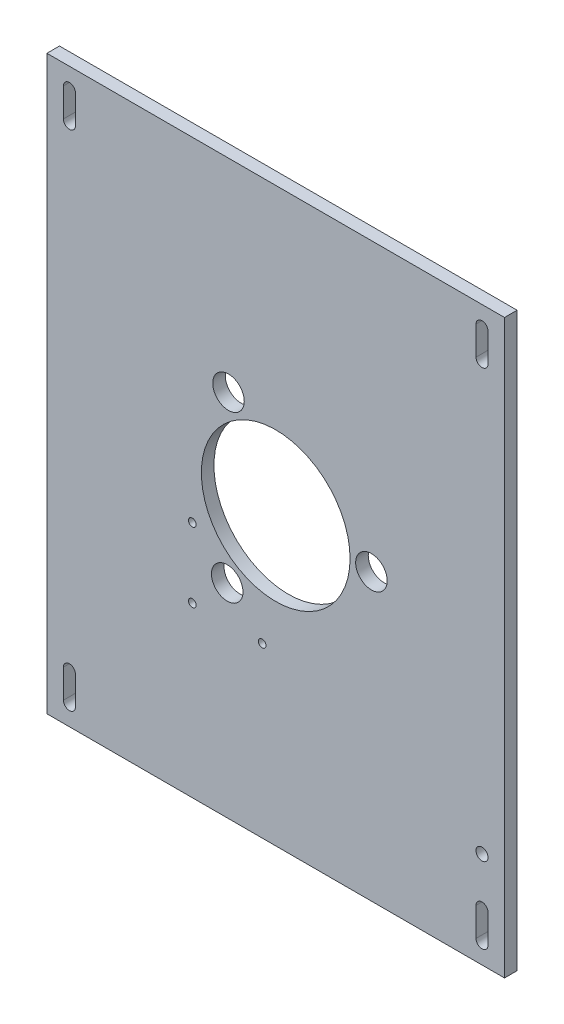
ISO-10303-21;
HEADER;
FILE_DESCRIPTION(('STEP AP214'),'2;1');
FILE_NAME('part.step','',(''),(''),'','','');
FILE_SCHEMA(('AUTOMOTIVE_DESIGN { 1 0 10303 214 1 1 1 1 }'));
ENDSEC;
DATA;
#1=APPLICATION_CONTEXT('core data for automotive mechanical design processes');
#2=APPLICATION_PROTOCOL_DEFINITION('international standard','automotive_design',2000,#1);
#3=PRODUCT_CONTEXT('',#1,'mechanical');
#4=PRODUCT('Part','Part','',(#3));
#5=PRODUCT_RELATED_PRODUCT_CATEGORY('part','',(#4));
#6=PRODUCT_DEFINITION_FORMATION('','',#4);
#7=PRODUCT_DEFINITION_CONTEXT('part definition',#1,'design');
#8=PRODUCT_DEFINITION('design','',#6,#7);
#9=PRODUCT_DEFINITION_SHAPE('','',#8);
#10=(LENGTH_UNIT() NAMED_UNIT(*) SI_UNIT(.MILLI.,.METRE.));
#11=(NAMED_UNIT(*) PLANE_ANGLE_UNIT() SI_UNIT($,.RADIAN.));
#12=(NAMED_UNIT(*) SI_UNIT($,.STERADIAN.) SOLID_ANGLE_UNIT());
#13=UNCERTAINTY_MEASURE_WITH_UNIT(LENGTH_MEASURE(1.E-05),#10,'distance_accuracy_value','');
#14=(GEOMETRIC_REPRESENTATION_CONTEXT(3) GLOBAL_UNCERTAINTY_ASSIGNED_CONTEXT((#13)) GLOBAL_UNIT_ASSIGNED_CONTEXT((#10,
#11,#12)) REPRESENTATION_CONTEXT('',''));
#15=CARTESIAN_POINT('',(0.,0.,0.));
#16=DIRECTION('',(0.,0.,1.));
#17=DIRECTION('',(1.,0.,0.));
#18=AXIS2_PLACEMENT_3D('',#15,#16,#17);
#19=CARTESIAN_POINT('',(0.,0.,5.588));
#20=DIRECTION('',(0.,0.,-1.));
#21=DIRECTION('',(-1.,0.,0.));
#22=AXIS2_PLACEMENT_3D('',#19,#20,#21);
#23=PLANE('',#22);
#24=DIRECTION('',(0.,1.,0.));
#25=VECTOR('',#24,1.);
#26=CARTESIAN_POINT('',(-94.265,118.11,5.58800000000004));
#27=LINE('',#26,#25);
#28=CARTESIAN_POINT('',(-94.265,105.41,5.58800000000004));
#29=VERTEX_POINT('',#28);
#30=CARTESIAN_POINT('',(-94.265,118.11,5.58800000000004));
#31=VERTEX_POINT('',#30);
#32=EDGE_CURVE('E184',#29,#31,#27,.T.);
#33=ORIENTED_EDGE('',*,*,#32,.T.);
#34=CARTESIAN_POINT('',(-91.6,118.11,5.58800000000004));
#35=DIRECTION('',(0.,0.,-1.));
#36=DIRECTION('',(1.,0.,0.));
#37=AXIS2_PLACEMENT_3D('',#34,#35,#36);
#38=CIRCLE('',#37,2.66500000000008);
#39=CARTESIAN_POINT('',(-88.9349999999999,118.11,5.58800000000004));
#40=VERTEX_POINT('',#39);
#41=EDGE_CURVE('E178',#31,#40,#38,.T.);
#42=ORIENTED_EDGE('',*,*,#41,.T.);
#43=DIRECTION('',(0.,-1.,0.));
#44=VECTOR('',#43,1.);
#45=CARTESIAN_POINT('',(-88.9349999999999,118.11,5.58800000000004));
#46=LINE('',#45,#44);
#47=CARTESIAN_POINT('',(-88.9349999999999,105.41,5.588));
#48=VERTEX_POINT('',#47);
#49=EDGE_CURVE('E187',#40,#48,#46,.T.);
#50=ORIENTED_EDGE('',*,*,#49,.T.);
#51=CARTESIAN_POINT('',(-91.6,105.41,5.58800000000004));
#52=DIRECTION('',(0.,0.,-1.));
#53=DIRECTION('',(1.,0.,0.));
#54=AXIS2_PLACEMENT_3D('',#51,#52,#53);
#55=CIRCLE('',#54,2.66500000000008);
#56=EDGE_CURVE('E54',#48,#29,#55,.T.);
#57=ORIENTED_EDGE('',*,*,#56,.T.);
#58=EDGE_LOOP('',(#33,#42,#50,#57));
#59=FACE_BOUND('',#58,.T.);
#60=CARTESIAN_POINT('',(91.6,118.11,5.58800000000004));
#61=DIRECTION('',(0.,0.,1.));
#62=DIRECTION('',(-1.,0.,0.));
#63=AXIS2_PLACEMENT_3D('',#60,#61,#62);
#64=CIRCLE('',#63,2.66500000000008);
#65=CARTESIAN_POINT('',(94.265,118.11,5.58800000000004));
#66=VERTEX_POINT('',#65);
#67=CARTESIAN_POINT('',(88.9349999999999,118.11,5.58800000000004));
#68=VERTEX_POINT('',#67);
#69=EDGE_CURVE('E243',#66,#68,#64,.T.);
#70=ORIENTED_EDGE('',*,*,#69,.F.);
#71=DIRECTION('',(0.,1.,0.));
#72=VECTOR('',#71,1.);
#73=CARTESIAN_POINT('',(94.265,118.11,5.58800000000004));
#74=LINE('',#73,#72);
#75=CARTESIAN_POINT('',(94.265,105.41,5.588));
#76=VERTEX_POINT('',#75);
#77=EDGE_CURVE('E245',#76,#66,#74,.T.);
#78=ORIENTED_EDGE('',*,*,#77,.F.);
#79=CARTESIAN_POINT('',(91.6,105.41,5.58800000000004));
#80=DIRECTION('',(0.,0.,1.));
#81=DIRECTION('',(-1.,0.,0.));
#82=AXIS2_PLACEMENT_3D('',#79,#80,#81);
#83=CIRCLE('',#82,2.66500000000008);
#84=CARTESIAN_POINT('',(88.9349999999999,105.41,5.58800000000004));
#85=VERTEX_POINT('',#84);
#86=EDGE_CURVE('E248',#85,#76,#83,.T.);
#87=ORIENTED_EDGE('',*,*,#86,.F.);
#88=DIRECTION('',(0.,-1.,0.));
#89=VECTOR('',#88,1.);
#90=CARTESIAN_POINT('',(88.9349999999999,118.11,5.58800000000004));
#91=LINE('',#90,#89);
#92=EDGE_CURVE('E251',#68,#85,#91,.T.);
#93=ORIENTED_EDGE('',*,*,#92,.F.);
#94=EDGE_LOOP('',(#70,#78,#87,#93));
#95=FACE_BOUND('',#94,.T.);
#96=DIRECTION('',(0.,-1.,0.));
#97=VECTOR('',#96,1.);
#98=CARTESIAN_POINT('',(94.265,-118.11,5.58800000000004));
#99=LINE('',#98,#97);
#100=CARTESIAN_POINT('',(94.265,-105.41,5.58800000000004));
#101=VERTEX_POINT('',#100);
#102=CARTESIAN_POINT('',(94.265,-118.11,5.58800000000004));
#103=VERTEX_POINT('',#102);
#104=EDGE_CURVE('E284',#101,#103,#99,.T.);
#105=ORIENTED_EDGE('',*,*,#104,.T.);
#106=CARTESIAN_POINT('',(91.6,-118.11,5.58800000000004));
#107=DIRECTION('',(0.,0.,-1.));
#108=DIRECTION('',(-1.,0.,0.));
#109=AXIS2_PLACEMENT_3D('',#106,#107,#108);
#110=CIRCLE('',#109,2.66500000000008);
#111=CARTESIAN_POINT('',(88.9349999999999,-118.11,5.58800000000004));
#112=VERTEX_POINT('',#111);
#113=EDGE_CURVE('E274',#103,#112,#110,.T.);
#114=ORIENTED_EDGE('',*,*,#113,.T.);
#115=DIRECTION('',(0.,1.,0.));
#116=VECTOR('',#115,1.);
#117=CARTESIAN_POINT('',(88.9349999999999,-118.11,5.58800000000004));
#118=LINE('',#117,#116);
#119=CARTESIAN_POINT('',(88.9349999999999,-105.41,5.588));
#120=VERTEX_POINT('',#119);
#121=EDGE_CURVE('E277',#112,#120,#118,.T.);
#122=ORIENTED_EDGE('',*,*,#121,.T.);
#123=CARTESIAN_POINT('',(91.6,-105.41,5.58800000000004));
#124=DIRECTION('',(0.,0.,-1.));
#125=DIRECTION('',(-1.,0.,0.));
#126=AXIS2_PLACEMENT_3D('',#123,#124,#125);
#127=CIRCLE('',#126,2.66500000000008);
#128=EDGE_CURVE('E281',#120,#101,#127,.T.);
#129=ORIENTED_EDGE('',*,*,#128,.T.);
#130=EDGE_LOOP('',(#105,#114,#122,#129));
#131=FACE_BOUND('',#130,.T.);
#132=CARTESIAN_POINT('',(91.6,-84.3249999936522,5.58800000000004));
#133=DIRECTION('',(0.,0.,1.));
#134=DIRECTION('',(1.,0.,0.));
#135=AXIS2_PLACEMENT_3D('',#132,#133,#134);
#136=CIRCLE('',#135,2.66500000000008);
#137=CARTESIAN_POINT('',(94.265,-84.3249999936522,5.58800000000004));
#138=VERTEX_POINT('',#137);
#139=EDGE_CURVE('E299',#138,#138,#136,.T.);
#140=ORIENTED_EDGE('',*,*,#139,.F.);
#141=EDGE_LOOP('',(#140));
#142=FACE_BOUND('',#141,.T.);
#143=CARTESIAN_POINT('',(-37.0355466155229,-21.139735697336,5.588));
#144=DIRECTION('',(0.,0.,-1.));
#145=DIRECTION('',(-1.,0.,0.));
#146=AXIS2_PLACEMENT_3D('',#143,#144,#145);
#147=CIRCLE('',#146,1.7);
#148=CARTESIAN_POINT('',(-38.7355466155229,-21.139735697336,5.588));
#149=VERTEX_POINT('',#148);
#150=EDGE_CURVE('E312',#149,#149,#147,.T.);
#151=ORIENTED_EDGE('',*,*,#150,.T.);
#152=EDGE_LOOP('',(#151));
#153=FACE_BOUND('',#152,.T.);
#154=CARTESIAN_POINT('',(-37.0355466155229,-52.139735697336,5.588));
#155=DIRECTION('',(0.,0.,-1.));
#156=DIRECTION('',(-1.,0.,0.));
#157=AXIS2_PLACEMENT_3D('',#154,#155,#156);
#158=CIRCLE('',#157,1.7);
#159=CARTESIAN_POINT('',(-38.7355466155229,-52.139735697336,5.588));
#160=VERTEX_POINT('',#159);
#161=EDGE_CURVE('E322',#160,#160,#158,.T.);
#162=ORIENTED_EDGE('',*,*,#161,.T.);
#163=EDGE_LOOP('',(#162));
#164=FACE_BOUND('',#163,.T.);
#165=CARTESIAN_POINT('',(-6.03554661552294,-52.139735697336,5.588));
#166=DIRECTION('',(0.,0.,-1.));
#167=DIRECTION('',(-1.,0.,0.));
#168=AXIS2_PLACEMENT_3D('',#165,#166,#167);
#169=CIRCLE('',#168,1.7);
#170=CARTESIAN_POINT('',(-7.73554661552294,-52.139735697336,5.588));
#171=VERTEX_POINT('',#170);
#172=EDGE_CURVE('E309',#171,#171,#169,.T.);
#173=ORIENTED_EDGE('',*,*,#172,.T.);
#174=EDGE_LOOP('',(#173));
#175=FACE_BOUND('',#174,.T.);
#176=CARTESIAN_POINT('',(-20.9631685940789,36.970198302095,5.58799999999998));
#177=DIRECTION('',(0.,0.,1.));
#178=DIRECTION('',(-0.500000000000004,0.866025403784436,0.));
#179=AXIS2_PLACEMENT_3D('',#176,#177,#178);
#180=CIRCLE('',#179,6.99999999999994);
#181=CARTESIAN_POINT('',(-24.4631685940789,43.032376128586,5.58799999999998));
#182=VERTEX_POINT('',#181);
#183=EDGE_CURVE('E330',#182,#182,#180,.T.);
#184=ORIENTED_EDGE('',*,*,#183,.F.);
#185=EDGE_LOOP('',(#184));
#186=FACE_BOUND('',#185,.T.);
#187=CARTESIAN_POINT('',(-21.5355466155229,-36.639735697336,5.58799999999998));
#188=DIRECTION('',(0.,0.,1.));
#189=DIRECTION('',(-0.499999999999992,-0.866025403784443,0.));
#190=AXIS2_PLACEMENT_3D('',#187,#188,#189);
#191=CIRCLE('',#190,6.99999999999994);
#192=CARTESIAN_POINT('',(-25.0355466155229,-42.7019135238271,5.58799999999998));
#193=VERTEX_POINT('',#192);
#194=EDGE_CURVE('E315',#193,#193,#191,.T.);
#195=ORIENTED_EDGE('',*,*,#194,.F.);
#196=EDGE_LOOP('',(#195));
#197=FACE_BOUND('',#196,.T.);
#198=CARTESIAN_POINT('',(42.498715209602,-0.330462604759246,5.58799999999998));
#199=DIRECTION('',(0.,0.,1.));
#200=DIRECTION('',(1.,0.,0.));
#201=AXIS2_PLACEMENT_3D('',#198,#199,#200);
#202=CIRCLE('',#201,6.99999999999994);
#203=CARTESIAN_POINT('',(49.4987152096019,-0.330462604759246,5.58799999999998));
#204=VERTEX_POINT('',#203);
#205=EDGE_CURVE('E336',#204,#204,#202,.T.);
#206=ORIENTED_EDGE('',*,*,#205,.F.);
#207=EDGE_LOOP('',(#206));
#208=FACE_BOUND('',#207,.T.);
#209=DIRECTION('',(0.,1.,0.));
#210=VECTOR('',#209,1.);
#211=CARTESIAN_POINT('',(101.6,-127.,5.588));
#212=LINE('',#211,#210);
#213=CARTESIAN_POINT('',(101.6,-127.,5.588));
#214=VERTEX_POINT('',#213);
#215=CARTESIAN_POINT('',(101.6,127.,5.588));
#216=VERTEX_POINT('',#215);
#217=EDGE_CURVE('E347',#214,#216,#212,.T.);
#218=ORIENTED_EDGE('',*,*,#217,.T.);
#219=DIRECTION('',(-1.,0.,0.));
#220=VECTOR('',#219,1.);
#221=CARTESIAN_POINT('',(-101.6,127.,5.588));
#222=LINE('',#221,#220);
#223=CARTESIAN_POINT('',(-101.6,127.,5.588));
#224=VERTEX_POINT('',#223);
#225=EDGE_CURVE('E350',#216,#224,#222,.T.);
#226=ORIENTED_EDGE('',*,*,#225,.T.);
#227=DIRECTION('',(0.,-1.,0.));
#228=VECTOR('',#227,1.);
#229=CARTESIAN_POINT('',(-101.6,-127.,5.588));
#230=LINE('',#229,#228);
#231=CARTESIAN_POINT('',(-101.6,-127.,5.588));
#232=VERTEX_POINT('',#231);
#233=EDGE_CURVE('E353',#224,#232,#230,.T.);
#234=ORIENTED_EDGE('',*,*,#233,.T.);
#235=DIRECTION('',(1.,0.,0.));
#236=VECTOR('',#235,1.);
#237=CARTESIAN_POINT('',(-101.6,-127.,5.588));
#238=LINE('',#237,#236);
#239=EDGE_CURVE('E355',#232,#214,#238,.T.);
#240=ORIENTED_EDGE('',*,*,#239,.T.);
#241=EDGE_LOOP('',(#218,#226,#234,#240));
#242=FACE_BOUND('',#241,.T.);
#243=CARTESIAN_POINT('',(0.,0.,5.588));
#244=DIRECTION('',(0.,0.,1.));
#245=DIRECTION('',(1.,0.,0.));
#246=AXIS2_PLACEMENT_3D('',#243,#244,#245);
#247=CIRCLE('',#246,33.02);
#248=CARTESIAN_POINT('',(33.02,0.,5.588));
#249=VERTEX_POINT('',#248);
#250=EDGE_CURVE('E340',#249,#249,#247,.T.);
#251=ORIENTED_EDGE('',*,*,#250,.F.);
#252=EDGE_LOOP('',(#251));
#253=FACE_BOUND('',#252,.T.);
#254=CARTESIAN_POINT('',(-91.6,-118.11,5.58800000000004));
#255=DIRECTION('',(0.,0.,1.));
#256=DIRECTION('',(1.,0.,0.));
#257=AXIS2_PLACEMENT_3D('',#254,#255,#256);
#258=CIRCLE('',#257,2.66500000000008);
#259=CARTESIAN_POINT('',(-94.265,-118.11,5.58800000000004));
#260=VERTEX_POINT('',#259);
#261=CARTESIAN_POINT('',(-88.9349999999999,-118.11,5.58800000000004));
#262=VERTEX_POINT('',#261);
#263=EDGE_CURVE('E212',#260,#262,#258,.T.);
#264=ORIENTED_EDGE('',*,*,#263,.F.);
#265=DIRECTION('',(0.,-1.,0.));
#266=VECTOR('',#265,1.);
#267=CARTESIAN_POINT('',(-94.265,-118.11,5.58800000000004));
#268=LINE('',#267,#266);
#269=CARTESIAN_POINT('',(-94.265,-105.41,5.588));
#270=VERTEX_POINT('',#269);
#271=EDGE_CURVE('E214',#270,#260,#268,.T.);
#272=ORIENTED_EDGE('',*,*,#271,.F.);
#273=CARTESIAN_POINT('',(-91.6,-105.41,5.58800000000004));
#274=DIRECTION('',(0.,0.,1.));
#275=DIRECTION('',(1.,0.,0.));
#276=AXIS2_PLACEMENT_3D('',#273,#274,#275);
#277=CIRCLE('',#276,2.66500000000008);
#278=CARTESIAN_POINT('',(-88.9349999999999,-105.41,5.58800000000004));
#279=VERTEX_POINT('',#278);
#280=EDGE_CURVE('E217',#279,#270,#277,.T.);
#281=ORIENTED_EDGE('',*,*,#280,.F.);
#282=DIRECTION('',(0.,1.,0.));
#283=VECTOR('',#282,1.);
#284=CARTESIAN_POINT('',(-88.9349999999999,-118.11,5.58800000000004));
#285=LINE('',#284,#283);
#286=EDGE_CURVE('E220',#262,#279,#285,.T.);
#287=ORIENTED_EDGE('',*,*,#286,.F.);
#288=EDGE_LOOP('',(#264,#272,#281,#287));
#289=FACE_BOUND('',#288,.T.);
#290=ADVANCED_FACE('F37',(#59,#95,#131,#142,#153,#164,#175,#186,#197,#208,#242,#253,#289),#23,.F.);
#291=CARTESIAN_POINT('',(0.,0.,0.));
#292=DIRECTION('',(0.,0.,-1.));
#293=DIRECTION('',(-1.,0.,0.));
#294=AXIS2_PLACEMENT_3D('',#291,#292,#293);
#295=PLANE('',#294);
#296=CARTESIAN_POINT('',(-91.6,118.11,0.));
#297=DIRECTION('',(0.,0.,-1.));
#298=DIRECTION('',(1.,0.,0.));
#299=AXIS2_PLACEMENT_3D('',#296,#297,#298);
#300=CIRCLE('',#299,2.66500000000008);
#301=CARTESIAN_POINT('',(-94.265,118.11,0.));
#302=VERTEX_POINT('',#301);
#303=CARTESIAN_POINT('',(-88.9349999999999,118.11,0.));
#304=VERTEX_POINT('',#303);
#305=EDGE_CURVE('E62',#302,#304,#300,.T.);
#306=ORIENTED_EDGE('',*,*,#305,.F.);
#307=DIRECTION('',(0.,1.,0.));
#308=VECTOR('',#307,1.);
#309=CARTESIAN_POINT('',(-94.265,118.11,0.));
#310=LINE('',#309,#308);
#311=CARTESIAN_POINT('',(-94.265,105.41,0.));
#312=VERTEX_POINT('',#311);
#313=EDGE_CURVE('E193',#312,#302,#310,.T.);
#314=ORIENTED_EDGE('',*,*,#313,.F.);
#315=CARTESIAN_POINT('',(-91.6,105.41,0.));
#316=DIRECTION('',(0.,0.,-1.));
#317=DIRECTION('',(1.,0.,0.));
#318=AXIS2_PLACEMENT_3D('',#315,#316,#317);
#319=CIRCLE('',#318,2.66500000000008);
#320=CARTESIAN_POINT('',(-88.9349999999999,105.41,0.));
#321=VERTEX_POINT('',#320);
#322=EDGE_CURVE('E196',#321,#312,#319,.T.);
#323=ORIENTED_EDGE('',*,*,#322,.F.);
#324=DIRECTION('',(0.,-1.,0.));
#325=VECTOR('',#324,1.);
#326=CARTESIAN_POINT('',(-88.9349999999999,118.11,0.));
#327=LINE('',#326,#325);
#328=EDGE_CURVE('E202',#304,#321,#327,.T.);
#329=ORIENTED_EDGE('',*,*,#328,.F.);
#330=EDGE_LOOP('',(#306,#314,#323,#329));
#331=FACE_BOUND('',#330,.T.);
#332=CARTESIAN_POINT('',(91.6,-118.11,0.));
#333=DIRECTION('',(0.,0.,-1.));
#334=DIRECTION('',(-1.,0.,0.));
#335=AXIS2_PLACEMENT_3D('',#332,#333,#334);
#336=CIRCLE('',#335,2.66500000000008);
#337=CARTESIAN_POINT('',(94.265,-118.11,0.));
#338=VERTEX_POINT('',#337);
#339=CARTESIAN_POINT('',(88.9349999999999,-118.11,0.));
#340=VERTEX_POINT('',#339);
#341=EDGE_CURVE('E267',#338,#340,#336,.T.);
#342=ORIENTED_EDGE('',*,*,#341,.F.);
#343=DIRECTION('',(0.,-1.,0.));
#344=VECTOR('',#343,1.);
#345=CARTESIAN_POINT('',(94.265,-118.11,0.));
#346=LINE('',#345,#344);
#347=CARTESIAN_POINT('',(94.265,-105.41,0.));
#348=VERTEX_POINT('',#347);
#349=EDGE_CURVE('E278',#348,#338,#346,.T.);
#350=ORIENTED_EDGE('',*,*,#349,.F.);
#351=CARTESIAN_POINT('',(91.6,-105.41,0.));
#352=DIRECTION('',(0.,0.,-1.));
#353=DIRECTION('',(-1.,0.,0.));
#354=AXIS2_PLACEMENT_3D('',#351,#352,#353);
#355=CIRCLE('',#354,2.66500000000008);
#356=CARTESIAN_POINT('',(88.9349999999999,-105.41,0.));
#357=VERTEX_POINT('',#356);
#358=EDGE_CURVE('E292',#357,#348,#355,.T.);
#359=ORIENTED_EDGE('',*,*,#358,.F.);
#360=DIRECTION('',(0.,1.,0.));
#361=VECTOR('',#360,1.);
#362=CARTESIAN_POINT('',(88.9349999999999,-118.11,0.));
#363=LINE('',#362,#361);
#364=EDGE_CURVE('E289',#340,#357,#363,.T.);
#365=ORIENTED_EDGE('',*,*,#364,.F.);
#366=EDGE_LOOP('',(#342,#350,#359,#365));
#367=FACE_BOUND('',#366,.T.);
#368=CARTESIAN_POINT('',(91.6,-84.3249999936522,0.));
#369=DIRECTION('',(0.,0.,1.));
#370=DIRECTION('',(1.,0.,0.));
#371=AXIS2_PLACEMENT_3D('',#368,#369,#370);
#372=CIRCLE('',#371,2.66500000000008);
#373=CARTESIAN_POINT('',(94.265,-84.3249999936522,0.));
#374=VERTEX_POINT('',#373);
#375=EDGE_CURVE('E306',#374,#374,#372,.T.);
#376=ORIENTED_EDGE('',*,*,#375,.T.);
#377=EDGE_LOOP('',(#376));
#378=FACE_BOUND('',#377,.T.);
#379=CARTESIAN_POINT('',(-37.0355466155229,-21.139735697336,0.));
#380=DIRECTION('',(0.,0.,-1.));
#381=DIRECTION('',(-1.,0.,0.));
#382=AXIS2_PLACEMENT_3D('',#379,#380,#381);
#383=CIRCLE('',#382,1.7);
#384=CARTESIAN_POINT('',(-38.7355466155229,-21.139735697336,0.));
#385=VERTEX_POINT('',#384);
#386=EDGE_CURVE('E316',#385,#385,#383,.T.);
#387=ORIENTED_EDGE('',*,*,#386,.F.);
#388=EDGE_LOOP('',(#387));
#389=FACE_BOUND('',#388,.T.);
#390=CARTESIAN_POINT('',(-37.0355466155229,-52.139735697336,0.));
#391=DIRECTION('',(0.,0.,-1.));
#392=DIRECTION('',(-1.,0.,0.));
#393=AXIS2_PLACEMENT_3D('',#390,#391,#392);
#394=CIRCLE('',#393,1.7);
#395=CARTESIAN_POINT('',(-38.7355466155229,-52.139735697336,0.));
#396=VERTEX_POINT('',#395);
#397=EDGE_CURVE('E319',#396,#396,#394,.T.);
#398=ORIENTED_EDGE('',*,*,#397,.F.);
#399=EDGE_LOOP('',(#398));
#400=FACE_BOUND('',#399,.T.);
#401=CARTESIAN_POINT('',(-6.03554661552294,-52.139735697336,0.));
#402=DIRECTION('',(0.,0.,-1.));
#403=DIRECTION('',(-1.,0.,0.));
#404=AXIS2_PLACEMENT_3D('',#401,#402,#403);
#405=CIRCLE('',#404,1.7);
#406=CARTESIAN_POINT('',(-7.73554661552294,-52.139735697336,0.));
#407=VERTEX_POINT('',#406);
#408=EDGE_CURVE('E325',#407,#407,#405,.T.);
#409=ORIENTED_EDGE('',*,*,#408,.F.);
#410=EDGE_LOOP('',(#409));
#411=FACE_BOUND('',#410,.T.);
#412=CARTESIAN_POINT('',(-20.9631685940789,36.970198302095,0.));
#413=DIRECTION('',(0.,0.,-1.));
#414=DIRECTION('',(-1.,0.,0.));
#415=AXIS2_PLACEMENT_3D('',#412,#413,#414);
#416=CIRCLE('',#415,6.99999999999994);
#417=CARTESIAN_POINT('',(-27.9631685940788,36.970198302095,0.));
#418=VERTEX_POINT('',#417);
#419=EDGE_CURVE('E41',#418,#418,#416,.T.);
#420=ORIENTED_EDGE('',*,*,#419,.F.);
#421=EDGE_LOOP('',(#420));
#422=FACE_BOUND('',#421,.T.);
#423=CARTESIAN_POINT('',(-21.5355466155229,-36.639735697336,0.));
#424=DIRECTION('',(0.,0.,-1.));
#425=DIRECTION('',(-1.,0.,0.));
#426=AXIS2_PLACEMENT_3D('',#423,#424,#425);
#427=CIRCLE('',#426,6.99999999999994);
#428=CARTESIAN_POINT('',(-28.5355466155229,-36.639735697336,0.));
#429=VERTEX_POINT('',#428);
#430=EDGE_CURVE('E333',#429,#429,#427,.T.);
#431=ORIENTED_EDGE('',*,*,#430,.F.);
#432=EDGE_LOOP('',(#431));
#433=FACE_BOUND('',#432,.T.);
#434=CARTESIAN_POINT('',(42.498715209602,-0.330462604759246,0.));
#435=DIRECTION('',(0.,0.,-1.));
#436=DIRECTION('',(-1.,0.,0.));
#437=AXIS2_PLACEMENT_3D('',#434,#435,#436);
#438=CIRCLE('',#437,6.99999999999994);
#439=CARTESIAN_POINT('',(35.4987152096021,-0.330462604759246,0.));
#440=VERTEX_POINT('',#439);
#441=EDGE_CURVE('E339',#440,#440,#438,.T.);
#442=ORIENTED_EDGE('',*,*,#441,.F.);
#443=EDGE_LOOP('',(#442));
#444=FACE_BOUND('',#443,.T.);
#445=DIRECTION('',(0.,1.,0.));
#446=VECTOR('',#445,1.);
#447=CARTESIAN_POINT('',(101.6,-127.,0.));
#448=LINE('',#447,#446);
#449=CARTESIAN_POINT('',(101.6,-127.,0.));
#450=VERTEX_POINT('',#449);
#451=CARTESIAN_POINT('',(101.6,127.,0.));
#452=VERTEX_POINT('',#451);
#453=EDGE_CURVE('E343',#450,#452,#448,.T.);
#454=ORIENTED_EDGE('',*,*,#453,.F.);
#455=DIRECTION('',(1.,0.,0.));
#456=VECTOR('',#455,1.);
#457=CARTESIAN_POINT('',(-101.6,-127.,0.));
#458=LINE('',#457,#456);
#459=CARTESIAN_POINT('',(-101.6,-127.,0.));
#460=VERTEX_POINT('',#459);
#461=EDGE_CURVE('E351',#460,#450,#458,.T.);
#462=ORIENTED_EDGE('',*,*,#461,.F.);
#463=DIRECTION('',(0.,-1.,0.));
#464=VECTOR('',#463,1.);
#465=CARTESIAN_POINT('',(-101.6,-127.,0.));
#466=LINE('',#465,#464);
#467=CARTESIAN_POINT('',(-101.6,127.,0.));
#468=VERTEX_POINT('',#467);
#469=EDGE_CURVE('E362',#468,#460,#466,.T.);
#470=ORIENTED_EDGE('',*,*,#469,.F.);
#471=DIRECTION('',(-1.,0.,0.));
#472=VECTOR('',#471,1.);
#473=CARTESIAN_POINT('',(-101.6,127.,0.));
#474=LINE('',#473,#472);
#475=EDGE_CURVE('E360',#452,#468,#474,.T.);
#476=ORIENTED_EDGE('',*,*,#475,.F.);
#477=EDGE_LOOP('',(#454,#462,#470,#476));
#478=FACE_BOUND('',#477,.T.);
#479=CARTESIAN_POINT('',(0.,0.,0.));
#480=DIRECTION('',(0.,0.,1.));
#481=DIRECTION('',(1.,0.,0.));
#482=AXIS2_PLACEMENT_3D('',#479,#480,#481);
#483=CIRCLE('',#482,33.02);
#484=CARTESIAN_POINT('',(33.02,0.,0.));
#485=VERTEX_POINT('',#484);
#486=EDGE_CURVE('E344',#485,#485,#483,.T.);
#487=ORIENTED_EDGE('',*,*,#486,.T.);
#488=EDGE_LOOP('',(#487));
#489=FACE_BOUND('',#488,.T.);
#490=DIRECTION('',(0.,1.,0.));
#491=VECTOR('',#490,1.);
#492=CARTESIAN_POINT('',(94.265,118.11,0.));
#493=LINE('',#492,#491);
#494=CARTESIAN_POINT('',(94.265,105.41,0.));
#495=VERTEX_POINT('',#494);
#496=CARTESIAN_POINT('',(94.265,118.11,0.));
#497=VERTEX_POINT('',#496);
#498=EDGE_CURVE('E256',#495,#497,#493,.T.);
#499=ORIENTED_EDGE('',*,*,#498,.T.);
#500=CARTESIAN_POINT('',(91.6,118.11,0.));
#501=DIRECTION('',(0.,0.,1.));
#502=DIRECTION('',(-1.,0.,0.));
#503=AXIS2_PLACEMENT_3D('',#500,#501,#502);
#504=CIRCLE('',#503,2.66500000000008);
#505=CARTESIAN_POINT('',(88.9349999999999,118.11,0.));
#506=VERTEX_POINT('',#505);
#507=EDGE_CURVE('E236',#497,#506,#504,.T.);
#508=ORIENTED_EDGE('',*,*,#507,.T.);
#509=DIRECTION('',(0.,-1.,0.));
#510=VECTOR('',#509,1.);
#511=CARTESIAN_POINT('',(88.9349999999999,118.11,0.));
#512=LINE('',#511,#510);
#513=CARTESIAN_POINT('',(88.9349999999999,105.41,0.));
#514=VERTEX_POINT('',#513);
#515=EDGE_CURVE('E246',#506,#514,#512,.T.);
#516=ORIENTED_EDGE('',*,*,#515,.T.);
#517=CARTESIAN_POINT('',(91.6,105.41,0.));
#518=DIRECTION('',(0.,0.,1.));
#519=DIRECTION('',(-1.,0.,0.));
#520=AXIS2_PLACEMENT_3D('',#517,#518,#519);
#521=CIRCLE('',#520,2.66500000000008);
#522=EDGE_CURVE('E259',#514,#495,#521,.T.);
#523=ORIENTED_EDGE('',*,*,#522,.T.);
#524=EDGE_LOOP('',(#499,#508,#516,#523));
#525=FACE_BOUND('',#524,.T.);
#526=DIRECTION('',(0.,-1.,0.));
#527=VECTOR('',#526,1.);
#528=CARTESIAN_POINT('',(-94.265,-118.11,0.));
#529=LINE('',#528,#527);
#530=CARTESIAN_POINT('',(-94.265,-105.41,0.));
#531=VERTEX_POINT('',#530);
#532=CARTESIAN_POINT('',(-94.265,-118.11,0.));
#533=VERTEX_POINT('',#532);
#534=EDGE_CURVE('E225',#531,#533,#529,.T.);
#535=ORIENTED_EDGE('',*,*,#534,.T.);
#536=CARTESIAN_POINT('',(-91.6,-118.11,0.));
#537=DIRECTION('',(0.,0.,1.));
#538=DIRECTION('',(1.,0.,0.));
#539=AXIS2_PLACEMENT_3D('',#536,#537,#538);
#540=CIRCLE('',#539,2.66500000000008);
#541=CARTESIAN_POINT('',(-88.9349999999999,-118.11,0.));
#542=VERTEX_POINT('',#541);
#543=EDGE_CURVE('E208',#533,#542,#540,.T.);
#544=ORIENTED_EDGE('',*,*,#543,.T.);
#545=DIRECTION('',(0.,1.,0.));
#546=VECTOR('',#545,1.);
#547=CARTESIAN_POINT('',(-88.9349999999999,-118.11,0.));
#548=LINE('',#547,#546);
#549=CARTESIAN_POINT('',(-88.9349999999999,-105.41,0.));
#550=VERTEX_POINT('',#549);
#551=EDGE_CURVE('E215',#542,#550,#548,.T.);
#552=ORIENTED_EDGE('',*,*,#551,.T.);
#553=CARTESIAN_POINT('',(-91.6,-105.41,0.));
#554=DIRECTION('',(0.,0.,1.));
#555=DIRECTION('',(1.,0.,0.));
#556=AXIS2_PLACEMENT_3D('',#553,#554,#555);
#557=CIRCLE('',#556,2.66500000000008);
#558=EDGE_CURVE('E228',#550,#531,#557,.T.);
#559=ORIENTED_EDGE('',*,*,#558,.T.);
#560=EDGE_LOOP('',(#535,#544,#552,#559));
#561=FACE_BOUND('',#560,.T.);
#562=ADVANCED_FACE('F382',(#331,#367,#378,#389,#400,#411,#422,#433,#444,#478,#489,#525,#561),
#295,.T.);
#563=CARTESIAN_POINT('',(101.6,-127.,5.588));
#564=DIRECTION('',(-1.,0.,0.));
#565=DIRECTION('',(0.,0.,1.));
#566=AXIS2_PLACEMENT_3D('',#563,#564,#565);
#567=PLANE('',#566);
#568=ORIENTED_EDGE('',*,*,#453,.T.);
#569=DIRECTION('',(0.,0.,-1.));
#570=VECTOR('',#569,1.);
#571=CARTESIAN_POINT('',(101.6,127.,5.588));
#572=LINE('',#571,#570);
#573=EDGE_CURVE('E11',#216,#452,#572,.T.);
#574=ORIENTED_EDGE('',*,*,#573,.F.);
#575=ORIENTED_EDGE('',*,*,#217,.F.);
#576=DIRECTION('',(0.,0.,-1.));
#577=VECTOR('',#576,1.);
#578=CARTESIAN_POINT('',(101.6,-127.,5.588));
#579=LINE('',#578,#577);
#580=EDGE_CURVE('E357',#214,#450,#579,.T.);
#581=ORIENTED_EDGE('',*,*,#580,.T.);
#582=EDGE_LOOP('',(#568,#574,#575,#581));
#583=FACE_BOUND('',#582,.T.);
#584=ADVANCED_FACE('F39',(#583),#567,.F.);
#585=CARTESIAN_POINT('',(-101.6,127.,5.588));
#586=DIRECTION('',(0.,-1.,0.));
#587=DIRECTION('',(0.,0.,-1.));
#588=AXIS2_PLACEMENT_3D('',#585,#586,#587);
#589=PLANE('',#588);
#590=ORIENTED_EDGE('',*,*,#475,.T.);
#591=DIRECTION('',(0.,0.,-1.));
#592=VECTOR('',#591,1.);
#593=CARTESIAN_POINT('',(-101.6,127.,5.588));
#594=LINE('',#593,#592);
#595=EDGE_CURVE('E46',#224,#468,#594,.T.);
#596=ORIENTED_EDGE('',*,*,#595,.F.);
#597=ORIENTED_EDGE('',*,*,#225,.F.);
#598=ORIENTED_EDGE('',*,*,#573,.T.);
#599=EDGE_LOOP('',(#590,#596,#597,#598));
#600=FACE_BOUND('',#599,.T.);
#601=ADVANCED_FACE('F437',(#600),#589,.F.);
#602=CARTESIAN_POINT('',(-101.6,-127.,5.588));
#603=DIRECTION('',(1.,0.,0.));
#604=DIRECTION('',(0.,0.,-1.));
#605=AXIS2_PLACEMENT_3D('',#602,#603,#604);
#606=PLANE('',#605);
#607=ORIENTED_EDGE('',*,*,#469,.T.);
#608=DIRECTION('',(0.,0.,-1.));
#609=VECTOR('',#608,1.);
#610=CARTESIAN_POINT('',(-101.6,-127.,5.588));
#611=LINE('',#610,#609);
#612=EDGE_CURVE('E367',#232,#460,#611,.T.);
#613=ORIENTED_EDGE('',*,*,#612,.F.);
#614=ORIENTED_EDGE('',*,*,#233,.F.);
#615=ORIENTED_EDGE('',*,*,#595,.T.);
#616=EDGE_LOOP('',(#607,#613,#614,#615));
#617=FACE_BOUND('',#616,.T.);
#618=ADVANCED_FACE('F434',(#617),#606,.F.);
#619=CARTESIAN_POINT('',(-101.6,-127.,5.588));
#620=DIRECTION('',(0.,1.,0.));
#621=DIRECTION('',(0.,0.,1.));
#622=AXIS2_PLACEMENT_3D('',#619,#620,#621);
#623=PLANE('',#622);
#624=ORIENTED_EDGE('',*,*,#461,.T.);
#625=ORIENTED_EDGE('',*,*,#580,.F.);
#626=ORIENTED_EDGE('',*,*,#239,.F.);
#627=ORIENTED_EDGE('',*,*,#612,.T.);
#628=EDGE_LOOP('',(#624,#625,#626,#627));
#629=FACE_BOUND('',#628,.T.);
#630=ADVANCED_FACE('F431',(#629),#623,.F.);
#631=CARTESIAN_POINT('',(0.,0.,5.588));
#632=DIRECTION('',(0.,0.,-1.));
#633=DIRECTION('',(-1.,0.,0.));
#634=AXIS2_PLACEMENT_3D('',#631,#632,#633);
#635=CYLINDRICAL_SURFACE('',#634,33.02);
#636=ORIENTED_EDGE('',*,*,#250,.T.);
#637=EDGE_LOOP('',(#636));
#638=FACE_BOUND('',#637,.T.);
#639=ORIENTED_EDGE('',*,*,#486,.F.);
#640=EDGE_LOOP('',(#639));
#641=FACE_BOUND('',#640,.T.);
#642=ADVANCED_FACE('F428',(#638,#641),#635,.F.);
#643=CARTESIAN_POINT('',(42.498715209602,-0.330462604759246,-4.41200000000002));
#644=DIRECTION('',(0.,0.,1.));
#645=DIRECTION('',(1.,0.,0.));
#646=AXIS2_PLACEMENT_3D('',#643,#644,#645);
#647=CYLINDRICAL_SURFACE('',#646,6.99999999999994);
#648=ORIENTED_EDGE('',*,*,#441,.T.);
#649=EDGE_LOOP('',(#648));
#650=FACE_BOUND('',#649,.T.);
#651=ORIENTED_EDGE('',*,*,#205,.T.);
#652=EDGE_LOOP('',(#651));
#653=FACE_BOUND('',#652,.T.);
#654=ADVANCED_FACE('F459',(#650,#653),#647,.F.);
#655=CARTESIAN_POINT('',(-21.5355466155229,-36.639735697336,-4.41200000000002));
#656=DIRECTION('',(0.,0.,1.));
#657=DIRECTION('',(1.,0.,0.));
#658=AXIS2_PLACEMENT_3D('',#655,#656,#657);
#659=CYLINDRICAL_SURFACE('',#658,6.99999999999994);
#660=ORIENTED_EDGE('',*,*,#430,.T.);
#661=EDGE_LOOP('',(#660));
#662=FACE_BOUND('',#661,.T.);
#663=ORIENTED_EDGE('',*,*,#194,.T.);
#664=EDGE_LOOP('',(#663));
#665=FACE_BOUND('',#664,.T.);
#666=ADVANCED_FACE('F463',(#662,#665),#659,.F.);
#667=CARTESIAN_POINT('',(-20.9631685940789,36.970198302095,-4.41200000000002));
#668=DIRECTION('',(0.,0.,1.));
#669=DIRECTION('',(1.,0.,0.));
#670=AXIS2_PLACEMENT_3D('',#667,#668,#669);
#671=CYLINDRICAL_SURFACE('',#670,6.99999999999994);
#672=ORIENTED_EDGE('',*,*,#419,.T.);
#673=EDGE_LOOP('',(#672));
#674=FACE_BOUND('',#673,.T.);
#675=ORIENTED_EDGE('',*,*,#183,.T.);
#676=EDGE_LOOP('',(#675));
#677=FACE_BOUND('',#676,.T.);
#678=ADVANCED_FACE('F379',(#674,#677),#671,.F.);
#679=CARTESIAN_POINT('',(-6.03554661552294,-52.139735697336,5.588));
#680=DIRECTION('',(0.,0.,-1.));
#681=DIRECTION('',(-1.,0.,0.));
#682=AXIS2_PLACEMENT_3D('',#679,#680,#681);
#683=CYLINDRICAL_SURFACE('',#682,1.7);
#684=ORIENTED_EDGE('',*,*,#172,.F.);
#685=EDGE_LOOP('',(#684));
#686=FACE_BOUND('',#685,.T.);
#687=ORIENTED_EDGE('',*,*,#408,.T.);
#688=EDGE_LOOP('',(#687));
#689=FACE_BOUND('',#688,.T.);
#690=ADVANCED_FACE('F473',(#686,#689),#683,.F.);
#691=CARTESIAN_POINT('',(-37.0355466155229,-52.139735697336,5.588));
#692=DIRECTION('',(0.,0.,-1.));
#693=DIRECTION('',(-1.,0.,0.));
#694=AXIS2_PLACEMENT_3D('',#691,#692,#693);
#695=CYLINDRICAL_SURFACE('',#694,1.7);
#696=ORIENTED_EDGE('',*,*,#161,.F.);
#697=EDGE_LOOP('',(#696));
#698=FACE_BOUND('',#697,.T.);
#699=ORIENTED_EDGE('',*,*,#397,.T.);
#700=EDGE_LOOP('',(#699));
#701=FACE_BOUND('',#700,.T.);
#702=ADVANCED_FACE('F476',(#698,#701),#695,.F.);
#703=CARTESIAN_POINT('',(-37.0355466155229,-21.139735697336,5.588));
#704=DIRECTION('',(0.,0.,-1.));
#705=DIRECTION('',(-1.,0.,0.));
#706=AXIS2_PLACEMENT_3D('',#703,#704,#705);
#707=CYLINDRICAL_SURFACE('',#706,1.7);
#708=ORIENTED_EDGE('',*,*,#150,.F.);
#709=EDGE_LOOP('',(#708));
#710=FACE_BOUND('',#709,.T.);
#711=ORIENTED_EDGE('',*,*,#386,.T.);
#712=EDGE_LOOP('',(#711));
#713=FACE_BOUND('',#712,.T.);
#714=ADVANCED_FACE('F480',(#710,#713),#707,.F.);
#715=CARTESIAN_POINT('',(91.6,-84.3249999936522,0.));
#716=DIRECTION('',(0.,0.,1.));
#717=DIRECTION('',(1.,0.,0.));
#718=AXIS2_PLACEMENT_3D('',#715,#716,#717);
#719=CYLINDRICAL_SURFACE('',#718,2.66500000000008);
#720=ORIENTED_EDGE('',*,*,#375,.F.);
#721=EDGE_LOOP('',(#720));
#722=FACE_BOUND('',#721,.T.);
#723=ORIENTED_EDGE('',*,*,#139,.T.);
#724=EDGE_LOOP('',(#723));
#725=FACE_BOUND('',#724,.T.);
#726=ADVANCED_FACE('F484',(#722,#725),#719,.F.);
#727=CARTESIAN_POINT('',(91.6,-118.11,5.58800000000004));
#728=DIRECTION('',(0.,0.,-1.));
#729=DIRECTION('',(-1.,0.,0.));
#730=AXIS2_PLACEMENT_3D('',#727,#728,#729);
#731=CYLINDRICAL_SURFACE('',#730,2.66500000000008);
#732=ORIENTED_EDGE('',*,*,#341,.T.);
#733=DIRECTION('',(0.,0.,-1.));
#734=VECTOR('',#733,1.);
#735=CARTESIAN_POINT('',(88.9349999999999,-118.11,5.58800000000004));
#736=LINE('',#735,#734);
#737=EDGE_CURVE('E287',#112,#340,#736,.T.);
#738=ORIENTED_EDGE('',*,*,#737,.F.);
#739=ORIENTED_EDGE('',*,*,#113,.F.);
#740=DIRECTION('',(0.,0.,-1.));
#741=VECTOR('',#740,1.);
#742=CARTESIAN_POINT('',(94.265,-118.11,5.58800000000004));
#743=LINE('',#742,#741);
#744=EDGE_CURVE('E297',#103,#338,#743,.T.);
#745=ORIENTED_EDGE('',*,*,#744,.T.);
#746=EDGE_LOOP('',(#732,#738,#739,#745));
#747=FACE_BOUND('',#746,.T.);
#748=ADVANCED_FACE('F488',(#747),#731,.F.);
#749=CARTESIAN_POINT('',(94.265,-118.11,5.58800000000004));
#750=DIRECTION('',(1.,0.,0.));
#751=DIRECTION('',(0.,0.,-1.));
#752=AXIS2_PLACEMENT_3D('',#749,#750,#751);
#753=PLANE('',#752);
#754=ORIENTED_EDGE('',*,*,#349,.T.);
#755=ORIENTED_EDGE('',*,*,#744,.F.);
#756=ORIENTED_EDGE('',*,*,#104,.F.);
#757=DIRECTION('',(0.,0.,-1.));
#758=VECTOR('',#757,1.);
#759=CARTESIAN_POINT('',(94.265,-105.41,5.58800000000004));
#760=LINE('',#759,#758);
#761=EDGE_CURVE('E300',#101,#348,#760,.T.);
#762=ORIENTED_EDGE('',*,*,#761,.T.);
#763=EDGE_LOOP('',(#754,#755,#756,#762));
#764=FACE_BOUND('',#763,.T.);
#765=ADVANCED_FACE('F492',(#764),#753,.F.);
#766=CARTESIAN_POINT('',(91.6,-105.41,5.58800000000004));
#767=DIRECTION('',(0.,0.,-1.));
#768=DIRECTION('',(-1.,0.,0.));
#769=AXIS2_PLACEMENT_3D('',#766,#767,#768);
#770=CYLINDRICAL_SURFACE('',#769,2.66500000000008);
#771=ORIENTED_EDGE('',*,*,#358,.T.);
#772=ORIENTED_EDGE('',*,*,#761,.F.);
#773=ORIENTED_EDGE('',*,*,#128,.F.);
#774=DIRECTION('',(0.,0.,-1.));
#775=VECTOR('',#774,1.);
#776=CARTESIAN_POINT('',(88.9349999999999,-105.41,5.58800000000004));
#777=LINE('',#776,#775);
#778=EDGE_CURVE('E302',#120,#357,#777,.T.);
#779=ORIENTED_EDGE('',*,*,#778,.T.);
#780=EDGE_LOOP('',(#771,#772,#773,#779));
#781=FACE_BOUND('',#780,.T.);
#782=ADVANCED_FACE('F498',(#781),#770,.F.);
#783=CARTESIAN_POINT('',(88.9349999999999,-118.11,5.58800000000004));
#784=DIRECTION('',(-1.,0.,0.));
#785=DIRECTION('',(0.,0.,1.));
#786=AXIS2_PLACEMENT_3D('',#783,#784,#785);
#787=PLANE('',#786);
#788=ORIENTED_EDGE('',*,*,#364,.T.);
#789=ORIENTED_EDGE('',*,*,#778,.F.);
#790=ORIENTED_EDGE('',*,*,#121,.F.);
#791=ORIENTED_EDGE('',*,*,#737,.T.);
#792=EDGE_LOOP('',(#788,#789,#790,#791));
#793=FACE_BOUND('',#792,.T.);
#794=ADVANCED_FACE('F494',(#793),#787,.F.);
#795=CARTESIAN_POINT('',(91.6,118.11,5.58800000000004));
#796=DIRECTION('',(0.,0.,-1.));
#797=DIRECTION('',(-1.,0.,0.));
#798=AXIS2_PLACEMENT_3D('',#795,#796,#797);
#799=CYLINDRICAL_SURFACE('',#798,2.66500000000008);
#800=ORIENTED_EDGE('',*,*,#507,.F.);
#801=DIRECTION('',(0.,0.,-1.));
#802=VECTOR('',#801,1.);
#803=CARTESIAN_POINT('',(94.265,118.11,5.58800000000004));
#804=LINE('',#803,#802);
#805=EDGE_CURVE('E253',#66,#497,#804,.T.);
#806=ORIENTED_EDGE('',*,*,#805,.F.);
#807=ORIENTED_EDGE('',*,*,#69,.T.);
#808=DIRECTION('',(0.,0.,-1.));
#809=VECTOR('',#808,1.);
#810=CARTESIAN_POINT('',(88.9349999999999,118.11,5.58800000000004));
#811=LINE('',#810,#809);
#812=EDGE_CURVE('E264',#68,#506,#811,.T.);
#813=ORIENTED_EDGE('',*,*,#812,.T.);
#814=EDGE_LOOP('',(#800,#806,#807,#813));
#815=FACE_BOUND('',#814,.T.);
#816=ADVANCED_FACE('F497',(#815),#799,.F.);
#817=CARTESIAN_POINT('',(88.9349999999999,118.11,5.58800000000004));
#818=DIRECTION('',(1.,0.,0.));
#819=DIRECTION('',(0.,0.,-1.));
#820=AXIS2_PLACEMENT_3D('',#817,#818,#819);
#821=PLANE('',#820);
#822=ORIENTED_EDGE('',*,*,#515,.F.);
#823=ORIENTED_EDGE('',*,*,#812,.F.);
#824=ORIENTED_EDGE('',*,*,#92,.T.);
#825=DIRECTION('',(0.,0.,-1.));
#826=VECTOR('',#825,1.);
#827=CARTESIAN_POINT('',(88.9349999999999,105.41,5.58800000000004));
#828=LINE('',#827,#826);
#829=EDGE_CURVE('E268',#85,#514,#828,.T.);
#830=ORIENTED_EDGE('',*,*,#829,.T.);
#831=EDGE_LOOP('',(#822,#823,#824,#830));
#832=FACE_BOUND('',#831,.T.);
#833=ADVANCED_FACE('F508',(#832),#821,.T.);
#834=CARTESIAN_POINT('',(91.6,105.41,5.58800000000004));
#835=DIRECTION('',(0.,0.,-1.));
#836=DIRECTION('',(-1.,0.,0.));
#837=AXIS2_PLACEMENT_3D('',#834,#835,#836);
#838=CYLINDRICAL_SURFACE('',#837,2.66500000000008);
#839=ORIENTED_EDGE('',*,*,#522,.F.);
#840=ORIENTED_EDGE('',*,*,#829,.F.);
#841=ORIENTED_EDGE('',*,*,#86,.T.);
#842=DIRECTION('',(0.,0.,-1.));
#843=VECTOR('',#842,1.);
#844=CARTESIAN_POINT('',(94.265,105.41,5.58800000000004));
#845=LINE('',#844,#843);
#846=EDGE_CURVE('E270',#76,#495,#845,.T.);
#847=ORIENTED_EDGE('',*,*,#846,.T.);
#848=EDGE_LOOP('',(#839,#840,#841,#847));
#849=FACE_BOUND('',#848,.T.);
#850=ADVANCED_FACE('F513',(#849),#838,.F.);
#851=CARTESIAN_POINT('',(94.265,118.11,5.58800000000004));
#852=DIRECTION('',(-1.,0.,0.));
#853=DIRECTION('',(0.,0.,1.));
#854=AXIS2_PLACEMENT_3D('',#851,#852,#853);
#855=PLANE('',#854);
#856=ORIENTED_EDGE('',*,*,#498,.F.);
#857=ORIENTED_EDGE('',*,*,#846,.F.);
#858=ORIENTED_EDGE('',*,*,#77,.T.);
#859=ORIENTED_EDGE('',*,*,#805,.T.);
#860=EDGE_LOOP('',(#856,#857,#858,#859));
#861=FACE_BOUND('',#860,.T.);
#862=ADVANCED_FACE('F510',(#861),#855,.T.);
#863=CARTESIAN_POINT('',(-91.6,-118.11,5.58800000000004));
#864=DIRECTION('',(0.,0.,-1.));
#865=DIRECTION('',(-1.,0.,0.));
#866=AXIS2_PLACEMENT_3D('',#863,#864,#865);
#867=CYLINDRICAL_SURFACE('',#866,2.66500000000008);
#868=ORIENTED_EDGE('',*,*,#543,.F.);
#869=DIRECTION('',(0.,0.,-1.));
#870=VECTOR('',#869,1.);
#871=CARTESIAN_POINT('',(-94.265,-118.11,5.58800000000004));
#872=LINE('',#871,#870);
#873=EDGE_CURVE('E222',#260,#533,#872,.T.);
#874=ORIENTED_EDGE('',*,*,#873,.F.);
#875=ORIENTED_EDGE('',*,*,#263,.T.);
#876=DIRECTION('',(0.,0.,-1.));
#877=VECTOR('',#876,1.);
#878=CARTESIAN_POINT('',(-88.9349999999999,-118.11,5.58800000000004));
#879=LINE('',#878,#877);
#880=EDGE_CURVE('E233',#262,#542,#879,.T.);
#881=ORIENTED_EDGE('',*,*,#880,.T.);
#882=EDGE_LOOP('',(#868,#874,#875,#881));
#883=FACE_BOUND('',#882,.T.);
#884=ADVANCED_FACE('F405',(#883),#867,.F.);
#885=CARTESIAN_POINT('',(-88.9349999999999,-118.11,5.58800000000004));
#886=DIRECTION('',(-1.,0.,0.));
#887=DIRECTION('',(0.,0.,1.));
#888=AXIS2_PLACEMENT_3D('',#885,#886,#887);
#889=PLANE('',#888);
#890=ORIENTED_EDGE('',*,*,#551,.F.);
#891=ORIENTED_EDGE('',*,*,#880,.F.);
#892=ORIENTED_EDGE('',*,*,#286,.T.);
#893=DIRECTION('',(0.,0.,-1.));
#894=VECTOR('',#893,1.);
#895=CARTESIAN_POINT('',(-88.9349999999999,-105.41,5.58800000000004));
#896=LINE('',#895,#894);
#897=EDGE_CURVE('E237',#279,#550,#896,.T.);
#898=ORIENTED_EDGE('',*,*,#897,.T.);
#899=EDGE_LOOP('',(#890,#891,#892,#898));
#900=FACE_BOUND('',#899,.T.);
#901=ADVANCED_FACE('F412',(#900),#889,.T.);
#902=CARTESIAN_POINT('',(-91.6,-105.41,5.58800000000004));
#903=DIRECTION('',(0.,0.,-1.));
#904=DIRECTION('',(-1.,0.,0.));
#905=AXIS2_PLACEMENT_3D('',#902,#903,#904);
#906=CYLINDRICAL_SURFACE('',#905,2.66500000000008);
#907=ORIENTED_EDGE('',*,*,#558,.F.);
#908=ORIENTED_EDGE('',*,*,#897,.F.);
#909=ORIENTED_EDGE('',*,*,#280,.T.);
#910=DIRECTION('',(0.,0.,-1.));
#911=VECTOR('',#910,1.);
#912=CARTESIAN_POINT('',(-94.265,-105.41,5.58800000000004));
#913=LINE('',#912,#911);
#914=EDGE_CURVE('E239',#270,#531,#913,.T.);
#915=ORIENTED_EDGE('',*,*,#914,.T.);
#916=EDGE_LOOP('',(#907,#908,#909,#915));
#917=FACE_BOUND('',#916,.T.);
#918=ADVANCED_FACE('F414',(#917),#906,.F.);
#919=CARTESIAN_POINT('',(-94.265,-118.11,5.58800000000004));
#920=DIRECTION('',(1.,0.,0.));
#921=DIRECTION('',(0.,0.,-1.));
#922=AXIS2_PLACEMENT_3D('',#919,#920,#921);
#923=PLANE('',#922);
#924=ORIENTED_EDGE('',*,*,#534,.F.);
#925=ORIENTED_EDGE('',*,*,#914,.F.);
#926=ORIENTED_EDGE('',*,*,#271,.T.);
#927=ORIENTED_EDGE('',*,*,#873,.T.);
#928=EDGE_LOOP('',(#924,#925,#926,#927));
#929=FACE_BOUND('',#928,.T.);
#930=ADVANCED_FACE('F400',(#929),#923,.T.);
#931=CARTESIAN_POINT('',(-91.6,118.11,5.58800000000004));
#932=DIRECTION('',(0.,0.,-1.));
#933=DIRECTION('',(-1.,0.,0.));
#934=AXIS2_PLACEMENT_3D('',#931,#932,#933);
#935=CYLINDRICAL_SURFACE('',#934,2.66500000000008);
#936=ORIENTED_EDGE('',*,*,#305,.T.);
#937=DIRECTION('',(0.,0.,-1.));
#938=VECTOR('',#937,1.);
#939=CARTESIAN_POINT('',(-88.9349999999999,118.11,5.58800000000004));
#940=LINE('',#939,#938);
#941=EDGE_CURVE('E174',#40,#304,#940,.T.);
#942=ORIENTED_EDGE('',*,*,#941,.F.);
#943=ORIENTED_EDGE('',*,*,#41,.F.);
#944=DIRECTION('',(0.,0.,-1.));
#945=VECTOR('',#944,1.);
#946=CARTESIAN_POINT('',(-94.265,118.11,5.58800000000004));
#947=LINE('',#946,#945);
#948=EDGE_CURVE('E206',#31,#302,#947,.T.);
#949=ORIENTED_EDGE('',*,*,#948,.T.);
#950=EDGE_LOOP('',(#936,#942,#943,#949));
#951=FACE_BOUND('',#950,.T.);
#952=ADVANCED_FACE('F176',(#951),#935,.F.);
#953=CARTESIAN_POINT('',(-94.265,118.11,5.58800000000004));
#954=DIRECTION('',(-1.,0.,0.));
#955=DIRECTION('',(0.,0.,1.));
#956=AXIS2_PLACEMENT_3D('',#953,#954,#955);
#957=PLANE('',#956);
#958=ORIENTED_EDGE('',*,*,#313,.T.);
#959=ORIENTED_EDGE('',*,*,#948,.F.);
#960=ORIENTED_EDGE('',*,*,#32,.F.);
#961=DIRECTION('',(0.,0.,-1.));
#962=VECTOR('',#961,1.);
#963=CARTESIAN_POINT('',(-94.265,105.41,5.58800000000004));
#964=LINE('',#963,#962);
#965=EDGE_CURVE('E209',#29,#312,#964,.T.);
#966=ORIENTED_EDGE('',*,*,#965,.T.);
#967=EDGE_LOOP('',(#958,#959,#960,#966));
#968=FACE_BOUND('',#967,.T.);
#969=ADVANCED_FACE('F552',(#968),#957,.F.);
#970=CARTESIAN_POINT('',(-91.6,105.41,5.58800000000004));
#971=DIRECTION('',(0.,0.,-1.));
#972=DIRECTION('',(-1.,0.,0.));
#973=AXIS2_PLACEMENT_3D('',#970,#971,#972);
#974=CYLINDRICAL_SURFACE('',#973,2.66500000000008);
#975=ORIENTED_EDGE('',*,*,#322,.T.);
#976=ORIENTED_EDGE('',*,*,#965,.F.);
#977=ORIENTED_EDGE('',*,*,#56,.F.);
#978=DIRECTION('',(0.,0.,-1.));
#979=VECTOR('',#978,1.);
#980=CARTESIAN_POINT('',(-88.9349999999999,105.41,5.58800000000004));
#981=LINE('',#980,#979);
#982=EDGE_CURVE('E183',#48,#321,#981,.T.);
#983=ORIENTED_EDGE('',*,*,#982,.T.);
#984=EDGE_LOOP('',(#975,#976,#977,#983));
#985=FACE_BOUND('',#984,.T.);
#986=ADVANCED_FACE('F562',(#985),#974,.F.);
#987=CARTESIAN_POINT('',(-88.9349999999999,118.11,5.58800000000004));
#988=DIRECTION('',(1.,0.,0.));
#989=DIRECTION('',(0.,0.,-1.));
#990=AXIS2_PLACEMENT_3D('',#987,#988,#989);
#991=PLANE('',#990);
#992=ORIENTED_EDGE('',*,*,#328,.T.);
#993=ORIENTED_EDGE('',*,*,#982,.F.);
#994=ORIENTED_EDGE('',*,*,#49,.F.);
#995=ORIENTED_EDGE('',*,*,#941,.T.);
#996=EDGE_LOOP('',(#992,#993,#994,#995));
#997=FACE_BOUND('',#996,.T.);
#998=ADVANCED_FACE('F188',(#997),#991,.F.);
#999=CLOSED_SHELL('',(#290,#562,#584,#601,#618,#630,#642,#654,#666,#678,#690,#702,#714,#726,
#748,#765,#782,#794,#816,#833,#850,#862,#884,#901,#918,#930,#952,#969,#986,#998));
#1000=MANIFOLD_SOLID_BREP('B2',#999);
#1001=ADVANCED_BREP_SHAPE_REPRESENTATION('',(#18,#1000),#14);
#1002=SHAPE_DEFINITION_REPRESENTATION(#9,#1001);
ENDSEC;
END-ISO-10303-21;
